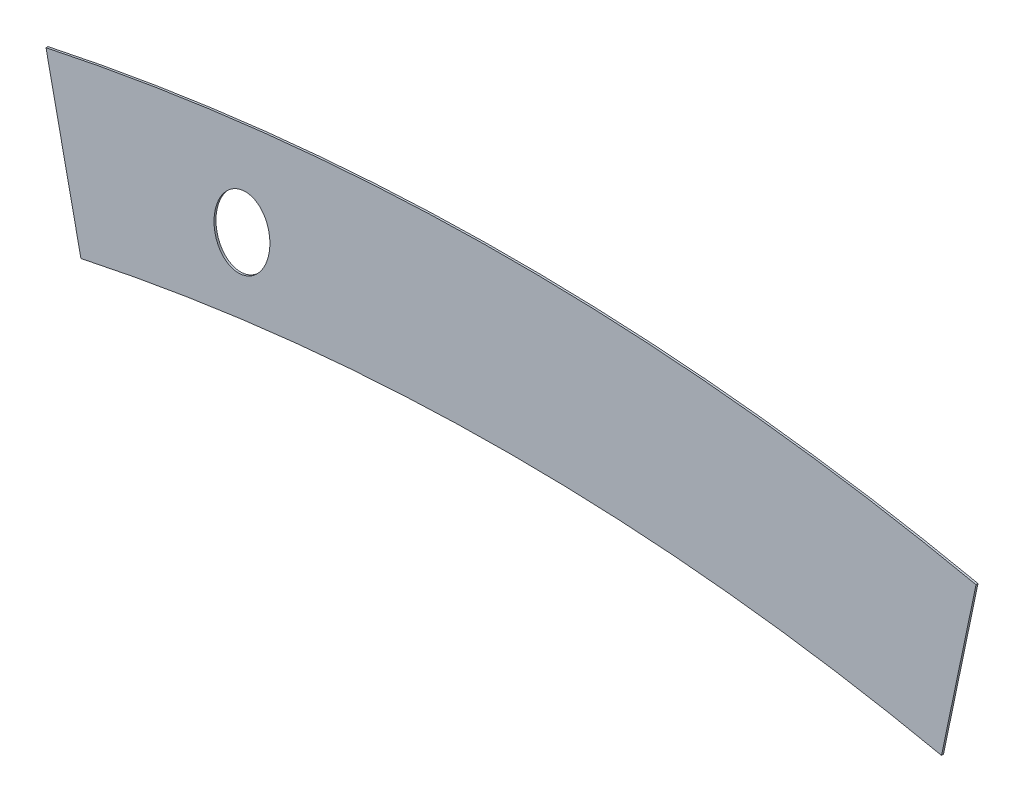
ISO-10303-21;
HEADER;
FILE_DESCRIPTION(('STEP AP214'),'2;1');
FILE_NAME('part.step','',(''),(''),'','','');
FILE_SCHEMA(('AUTOMOTIVE_DESIGN { 1 0 10303 214 1 1 1 1 }'));
ENDSEC;
DATA;
#1=APPLICATION_CONTEXT('core data for automotive mechanical design processes');
#2=APPLICATION_PROTOCOL_DEFINITION('international standard','automotive_design',2000,#1);
#3=PRODUCT_CONTEXT('',#1,'mechanical');
#4=PRODUCT('Part','Part','',(#3));
#5=PRODUCT_RELATED_PRODUCT_CATEGORY('part','',(#4));
#6=PRODUCT_DEFINITION_FORMATION('','',#4);
#7=PRODUCT_DEFINITION_CONTEXT('part definition',#1,'design');
#8=PRODUCT_DEFINITION('design','',#6,#7);
#9=PRODUCT_DEFINITION_SHAPE('','',#8);
#10=(LENGTH_UNIT() NAMED_UNIT(*) SI_UNIT(.MILLI.,.METRE.));
#11=(NAMED_UNIT(*) PLANE_ANGLE_UNIT() SI_UNIT($,.RADIAN.));
#12=(NAMED_UNIT(*) SI_UNIT($,.STERADIAN.) SOLID_ANGLE_UNIT());
#13=UNCERTAINTY_MEASURE_WITH_UNIT(LENGTH_MEASURE(1.E-05),#10,'distance_accuracy_value','');
#14=(GEOMETRIC_REPRESENTATION_CONTEXT(3) GLOBAL_UNCERTAINTY_ASSIGNED_CONTEXT((#13)) GLOBAL_UNIT_ASSIGNED_CONTEXT((#10,
#11,#12)) REPRESENTATION_CONTEXT('',''));
#15=CARTESIAN_POINT('',(0.,0.,0.));
#16=DIRECTION('',(0.,0.,1.));
#17=DIRECTION('',(1.,0.,0.));
#18=AXIS2_PLACEMENT_3D('',#15,#16,#17);
#19=CARTESIAN_POINT('',(1.10194133163969E-12,-3599.3324,-3.175));
#20=DIRECTION('',(0.,0.,1.));
#21=DIRECTION('',(1.,0.,0.));
#22=AXIS2_PLACEMENT_3D('',#19,#20,#21);
#23=CYLINDRICAL_SURFACE('',#22,3599.3324);
#24=CARTESIAN_POINT('',(1.10194133163969E-12,-3599.3324,0.));
#25=DIRECTION('',(0.,0.,1.));
#26=DIRECTION('',(1.,0.,0.));
#27=AXIS2_PLACEMENT_3D('',#24,#25,#26);
#28=CIRCLE('',#27,3599.3324);
#29=CARTESIAN_POINT('',(752.475,-79.53480637835,0.));
#30=VERTEX_POINT('',#29);
#31=CARTESIAN_POINT('',(-752.475,-79.5348063783502,0.));
#32=VERTEX_POINT('',#31);
#33=EDGE_CURVE('E72',#30,#32,#28,.T.);
#34=ORIENTED_EDGE('',*,*,#33,.F.);
#35=DIRECTION('',(0.,0.,1.));
#36=VECTOR('',#35,1.);
#37=CARTESIAN_POINT('',(752.475,-79.53480637835,-3.175));
#38=LINE('',#37,#36);
#39=CARTESIAN_POINT('',(752.475,-79.53480637835,-3.175));
#40=VERTEX_POINT('',#39);
#41=EDGE_CURVE('E11',#40,#30,#38,.T.);
#42=ORIENTED_EDGE('',*,*,#41,.F.);
#43=CARTESIAN_POINT('',(1.10194133163969E-12,-3599.3324,-3.175));
#44=DIRECTION('',(0.,0.,1.));
#45=DIRECTION('',(1.,0.,0.));
#46=AXIS2_PLACEMENT_3D('',#43,#44,#45);
#47=CIRCLE('',#46,3599.3324);
#48=CARTESIAN_POINT('',(-752.475,-79.5348063783502,-3.175));
#49=VERTEX_POINT('',#48);
#50=EDGE_CURVE('E74',#40,#49,#47,.T.);
#51=ORIENTED_EDGE('',*,*,#50,.T.);
#52=DIRECTION('',(0.,0.,1.));
#53=VECTOR('',#52,1.);
#54=CARTESIAN_POINT('',(-752.475,-79.5348063783502,-3.175));
#55=LINE('',#54,#53);
#56=EDGE_CURVE('E35',#49,#32,#55,.T.);
#57=ORIENTED_EDGE('',*,*,#56,.T.);
#58=EDGE_LOOP('',(#34,#42,#51,#57));
#59=FACE_BOUND('',#58,.T.);
#60=ADVANCED_FACE('F32',(#59),#23,.T.);
#61=CARTESIAN_POINT('',(752.475,-79.53480637835,-3.175));
#62=DIRECTION('',(0.978835442064773,-0.204648912427747,0.));
#63=DIRECTION('',(0.204648912427747,0.978835442064773,0.));
#64=AXIS2_PLACEMENT_3D('',#61,#62,#63);
#65=PLANE('',#64);
#66=DIRECTION('',(0.204648912427747,0.978835442064773,0.));
#67=VECTOR('',#66,1.);
#68=CARTESIAN_POINT('',(752.475,-79.53480637835,0.));
#69=LINE('',#68,#67);
#70=CARTESIAN_POINT('',(696.595,-346.808762803068,0.));
#71=VERTEX_POINT('',#70);
#72=EDGE_CURVE('E89',#71,#30,#69,.T.);
#73=ORIENTED_EDGE('',*,*,#72,.F.);
#74=DIRECTION('',(0.,0.,1.));
#75=VECTOR('',#74,1.);
#76=CARTESIAN_POINT('',(696.595,-346.808762803068,-3.175));
#77=LINE('',#76,#75);
#78=CARTESIAN_POINT('',(696.595,-346.808762803068,-3.175));
#79=VERTEX_POINT('',#78);
#80=EDGE_CURVE('E40',#79,#71,#77,.T.);
#81=ORIENTED_EDGE('',*,*,#80,.F.);
#82=DIRECTION('',(0.204648912427747,0.978835442064773,0.));
#83=VECTOR('',#82,1.);
#84=CARTESIAN_POINT('',(752.475,-79.53480637835,-3.175));
#85=LINE('',#84,#83);
#86=EDGE_CURVE('E79',#79,#40,#85,.T.);
#87=ORIENTED_EDGE('',*,*,#86,.T.);
#88=ORIENTED_EDGE('',*,*,#41,.T.);
#89=EDGE_LOOP('',(#73,#81,#87,#88));
#90=FACE_BOUND('',#89,.T.);
#91=ADVANCED_FACE('F110',(#90),#65,.T.);
#92=CARTESIAN_POINT('',(1.10194133163969E-12,-3599.3324,-3.175));
#93=DIRECTION('',(0.,0.,1.));
#94=DIRECTION('',(1.,0.,0.));
#95=AXIS2_PLACEMENT_3D('',#92,#93,#94);
#96=CYLINDRICAL_SURFACE('',#95,3326.2824);
#97=CARTESIAN_POINT('',(1.10194133163969E-12,-3599.3324,0.));
#98=DIRECTION('',(0.,0.,-1.));
#99=DIRECTION('',(1.,0.,0.));
#100=AXIS2_PLACEMENT_3D('',#97,#98,#99);
#101=CIRCLE('',#100,3326.2824);
#102=CARTESIAN_POINT('',(-695.96,-346.672829287173,0.));
#103=VERTEX_POINT('',#102);
#104=EDGE_CURVE('E86',#103,#71,#101,.T.);
#105=ORIENTED_EDGE('',*,*,#104,.F.);
#106=DIRECTION('',(0.,0.,1.));
#107=VECTOR('',#106,1.);
#108=CARTESIAN_POINT('',(-695.96,-346.672829287173,-3.175));
#109=LINE('',#108,#107);
#110=CARTESIAN_POINT('',(-695.96,-346.672829287173,-3.175));
#111=VERTEX_POINT('',#110);
#112=EDGE_CURVE('E78',#111,#103,#109,.T.);
#113=ORIENTED_EDGE('',*,*,#112,.F.);
#114=CARTESIAN_POINT('',(1.10194133163969E-12,-3599.3324,-3.175));
#115=DIRECTION('',(0.,0.,-1.));
#116=DIRECTION('',(1.,0.,0.));
#117=AXIS2_PLACEMENT_3D('',#114,#115,#116);
#118=CIRCLE('',#117,3326.2824);
#119=EDGE_CURVE('E103',#111,#79,#118,.T.);
#120=ORIENTED_EDGE('',*,*,#119,.T.);
#121=ORIENTED_EDGE('',*,*,#80,.T.);
#122=EDGE_LOOP('',(#105,#113,#120,#121));
#123=FACE_BOUND('',#122,.T.);
#124=ADVANCED_FACE('F107',(#123),#96,.F.);
#125=CARTESIAN_POINT('',(-752.475,-79.5348063783502,-3.175));
#126=DIRECTION('',(-0.9783459703348,-0.206976236147196,0.));
#127=DIRECTION('',(0.206976236147196,-0.9783459703348,0.));
#128=AXIS2_PLACEMENT_3D('',#125,#126,#127);
#129=PLANE('',#128);
#130=DIRECTION('',(0.206976236147196,-0.9783459703348,0.));
#131=VECTOR('',#130,1.);
#132=CARTESIAN_POINT('',(-752.475,-79.5348063783502,0.));
#133=LINE('',#132,#131);
#134=EDGE_CURVE('E81',#32,#103,#133,.T.);
#135=ORIENTED_EDGE('',*,*,#134,.F.);
#136=ORIENTED_EDGE('',*,*,#56,.F.);
#137=DIRECTION('',(0.206976236147196,-0.9783459703348,0.));
#138=VECTOR('',#137,1.);
#139=CARTESIAN_POINT('',(-752.475,-79.5348063783502,-3.175));
#140=LINE('',#139,#138);
#141=EDGE_CURVE('E101',#49,#111,#140,.T.);
#142=ORIENTED_EDGE('',*,*,#141,.T.);
#143=ORIENTED_EDGE('',*,*,#112,.T.);
#144=EDGE_LOOP('',(#135,#136,#142,#143));
#145=FACE_BOUND('',#144,.T.);
#146=ADVANCED_FACE('F82',(#145),#129,.T.);
#147=CARTESIAN_POINT('',(1.10194133163969E-12,-3599.3324,-3.175));
#148=DIRECTION('',(0.,0.,1.));
#149=DIRECTION('',(1.,0.,0.));
#150=AXIS2_PLACEMENT_3D('',#147,#148,#149);
#151=PLANE('',#150);
#152=CARTESIAN_POINT('',(-435.383088956621,-179.737008178396,-3.175));
#153=DIRECTION('',(0.,0.,1.));
#154=DIRECTION('',(-0.200564989204777,-0.97968039946979,0.));
#155=AXIS2_PLACEMENT_3D('',#152,#153,#154);
#156=ELLIPSE('',#155,60.325,44.4499999999999);
#157=CARTESIAN_POINT('',(-447.482171930399,-238.836228276411,-3.175));
#158=VERTEX_POINT('',#157);
#159=EDGE_CURVE('E90',#158,#158,#156,.T.);
#160=ORIENTED_EDGE('',*,*,#159,.T.);
#161=EDGE_LOOP('',(#160));
#162=FACE_BOUND('',#161,.T.);
#163=ORIENTED_EDGE('',*,*,#50,.F.);
#164=ORIENTED_EDGE('',*,*,#86,.F.);
#165=ORIENTED_EDGE('',*,*,#119,.F.);
#166=ORIENTED_EDGE('',*,*,#141,.F.);
#167=EDGE_LOOP('',(#163,#164,#165,#166));
#168=FACE_BOUND('',#167,.T.);
#169=ADVANCED_FACE('F112',(#162,#168),#151,.F.);
#170=CARTESIAN_POINT('',(1.10194133163969E-12,-3599.3324,0.));
#171=DIRECTION('',(0.,0.,1.));
#172=DIRECTION('',(1.,0.,0.));
#173=AXIS2_PLACEMENT_3D('',#170,#171,#172);
#174=PLANE('',#173);
#175=CARTESIAN_POINT('',(-435.383088956621,-179.737008178396,0.));
#176=DIRECTION('',(0.,0.,1.));
#177=DIRECTION('',(-0.200564989204777,-0.97968039946979,0.));
#178=AXIS2_PLACEMENT_3D('',#175,#176,#177);
#179=ELLIPSE('',#178,60.325,44.4499999999999);
#180=CARTESIAN_POINT('',(-447.482171930399,-238.836228276411,0.));
#181=VERTEX_POINT('',#180);
#182=EDGE_CURVE('E93',#181,#181,#179,.T.);
#183=ORIENTED_EDGE('',*,*,#182,.F.);
#184=EDGE_LOOP('',(#183));
#185=FACE_BOUND('',#184,.T.);
#186=ORIENTED_EDGE('',*,*,#33,.T.);
#187=ORIENTED_EDGE('',*,*,#134,.T.);
#188=ORIENTED_EDGE('',*,*,#104,.T.);
#189=ORIENTED_EDGE('',*,*,#72,.T.);
#190=EDGE_LOOP('',(#186,#187,#188,#189));
#191=FACE_BOUND('',#190,.T.);
#192=ADVANCED_FACE('F88',(#185,#191),#174,.T.);
#193=DIRECTION('',(0.,0.,1.));
#194=VECTOR('',#193,1.);
#195=SURFACE_OF_LINEAR_EXTRUSION('',#156,#194);
#196=ORIENTED_EDGE('',*,*,#159,.F.);
#197=EDGE_LOOP('',(#196));
#198=FACE_BOUND('',#197,.T.);
#199=ORIENTED_EDGE('',*,*,#182,.T.);
#200=EDGE_LOOP('',(#199));
#201=FACE_BOUND('',#200,.T.);
#202=ADVANCED_FACE('F120',(#198,#201),#195,.F.);
#203=CLOSED_SHELL('',(#60,#91,#124,#146,#169,#192,#202));
#204=MANIFOLD_SOLID_BREP('B2',#203);
#205=ADVANCED_BREP_SHAPE_REPRESENTATION('',(#18,#204),#14);
#206=SHAPE_DEFINITION_REPRESENTATION(#9,#205);
ENDSEC;
END-ISO-10303-21;
